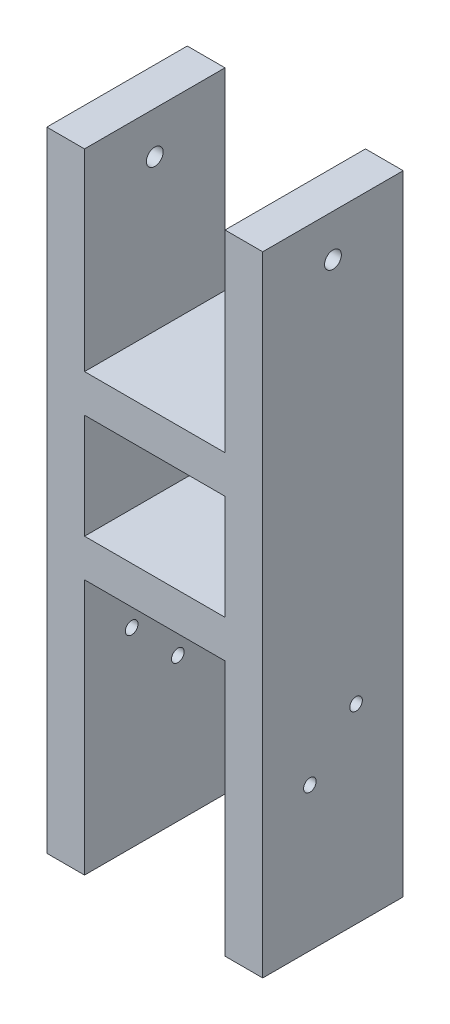
ISO-10303-21;
HEADER;
FILE_DESCRIPTION(('STEP AP214'),'2;1');
FILE_NAME('part.step','',(''),(''),'','','');
FILE_SCHEMA(('AUTOMOTIVE_DESIGN { 1 0 10303 214 1 1 1 1 }'));
ENDSEC;
DATA;
#1=APPLICATION_CONTEXT('core data for automotive mechanical design processes');
#2=APPLICATION_PROTOCOL_DEFINITION('international standard','automotive_design',2000,#1);
#3=PRODUCT_CONTEXT('',#1,'mechanical');
#4=PRODUCT('Part','Part','',(#3));
#5=PRODUCT_RELATED_PRODUCT_CATEGORY('part','',(#4));
#6=PRODUCT_DEFINITION_FORMATION('','',#4);
#7=PRODUCT_DEFINITION_CONTEXT('part definition',#1,'design');
#8=PRODUCT_DEFINITION('design','',#6,#7);
#9=PRODUCT_DEFINITION_SHAPE('','',#8);
#10=(LENGTH_UNIT() NAMED_UNIT(*) SI_UNIT(.MILLI.,.METRE.));
#11=(NAMED_UNIT(*) PLANE_ANGLE_UNIT() SI_UNIT($,.RADIAN.));
#12=(NAMED_UNIT(*) SI_UNIT($,.STERADIAN.) SOLID_ANGLE_UNIT());
#13=UNCERTAINTY_MEASURE_WITH_UNIT(LENGTH_MEASURE(1.E-05),#10,'distance_accuracy_value','');
#14=(GEOMETRIC_REPRESENTATION_CONTEXT(3) GLOBAL_UNCERTAINTY_ASSIGNED_CONTEXT((#13)) GLOBAL_UNIT_ASSIGNED_CONTEXT((#10,
#11,#12)) REPRESENTATION_CONTEXT('',''));
#15=CARTESIAN_POINT('',(0.,0.,0.));
#16=DIRECTION('',(0.,0.,1.));
#17=DIRECTION('',(1.,0.,0.));
#18=AXIS2_PLACEMENT_3D('',#15,#16,#17);
#19=CARTESIAN_POINT('',(0.,0.,67.));
#20=DIRECTION('',(0.,0.,1.));
#21=DIRECTION('',(1.,0.,0.));
#22=AXIS2_PLACEMENT_3D('',#19,#20,#21);
#23=PLANE('',#22);
#24=DIRECTION('',(1.,0.,0.));
#25=VECTOR('',#24,1.);
#26=CARTESIAN_POINT('',(68.3306347343382,23.6604982787696,67.));
#27=LINE('',#26,#25);
#28=CARTESIAN_POINT('',(1.33063473433824,23.6604982787696,67.));
#29=VERTEX_POINT('',#28);
#30=CARTESIAN_POINT('',(68.3306347343382,23.6604982787696,67.));
#31=VERTEX_POINT('',#30);
#32=EDGE_CURVE('E183',#29,#31,#27,.T.);
#33=ORIENTED_EDGE('',*,*,#32,.T.);
#34=DIRECTION('',(0.,-1.,0.));
#35=VECTOR('',#34,1.);
#36=CARTESIAN_POINT('',(68.3306347343382,23.6604982787696,67.));
#37=LINE('',#36,#35);
#38=CARTESIAN_POINT('',(68.3306347343382,-98.3395017212304,67.));
#39=VERTEX_POINT('',#38);
#40=EDGE_CURVE('E186',#31,#39,#37,.T.);
#41=ORIENTED_EDGE('',*,*,#40,.T.);
#42=DIRECTION('',(1.,0.,0.));
#43=VECTOR('',#42,1.);
#44=CARTESIAN_POINT('',(68.3306347343382,-98.3395017212304,67.));
#45=LINE('',#44,#43);
#46=CARTESIAN_POINT('',(86.3306347343382,-98.3395017212304,67.));
#47=VERTEX_POINT('',#46);
#48=EDGE_CURVE('E189',#39,#47,#45,.T.);
#49=ORIENTED_EDGE('',*,*,#48,.T.);
#50=DIRECTION('',(0.,1.,0.));
#51=VECTOR('',#50,1.);
#52=CARTESIAN_POINT('',(86.3306347343382,-98.3395017212304,67.));
#53=LINE('',#52,#51);
#54=CARTESIAN_POINT('',(86.3306347343382,201.66049827877,67.));
#55=VERTEX_POINT('',#54);
#56=EDGE_CURVE('E191',#47,#55,#53,.T.);
#57=ORIENTED_EDGE('',*,*,#56,.T.);
#58=DIRECTION('',(-1.,0.,0.));
#59=VECTOR('',#58,1.);
#60=CARTESIAN_POINT('',(86.3306347343382,201.66049827877,67.));
#61=LINE('',#60,#59);
#62=CARTESIAN_POINT('',(68.3306347343383,201.66049827877,67.));
#63=VERTEX_POINT('',#62);
#64=EDGE_CURVE('E193',#55,#63,#61,.T.);
#65=ORIENTED_EDGE('',*,*,#64,.T.);
#66=DIRECTION('',(0.,-1.,0.));
#67=VECTOR('',#66,1.);
#68=CARTESIAN_POINT('',(68.3306347343382,109.66049827877,67.));
#69=LINE('',#68,#67);
#70=CARTESIAN_POINT('',(68.3306347343382,109.66049827877,67.));
#71=VERTEX_POINT('',#70);
#72=EDGE_CURVE('E195',#63,#71,#69,.T.);
#73=ORIENTED_EDGE('',*,*,#72,.T.);
#74=DIRECTION('',(-1.,0.,0.));
#75=VECTOR('',#74,1.);
#76=CARTESIAN_POINT('',(68.3306347343382,109.66049827877,67.));
#77=LINE('',#76,#75);
#78=CARTESIAN_POINT('',(1.33063473433823,109.66049827877,67.));
#79=VERTEX_POINT('',#78);
#80=EDGE_CURVE('E197',#71,#79,#77,.T.);
#81=ORIENTED_EDGE('',*,*,#80,.T.);
#82=DIRECTION('',(0.,1.,0.));
#83=VECTOR('',#82,1.);
#84=CARTESIAN_POINT('',(1.33063473433823,109.66049827877,67.));
#85=LINE('',#84,#83);
#86=CARTESIAN_POINT('',(1.33063473433821,201.66049827877,67.));
#87=VERTEX_POINT('',#86);
#88=EDGE_CURVE('E199',#79,#87,#85,.T.);
#89=ORIENTED_EDGE('',*,*,#88,.T.);
#90=DIRECTION('',(-1.,0.,0.));
#91=VECTOR('',#90,1.);
#92=CARTESIAN_POINT('',(-16.6693652656617,201.66049827877,67.));
#93=LINE('',#92,#91);
#94=CARTESIAN_POINT('',(-16.6693652656617,201.66049827877,67.));
#95=VERTEX_POINT('',#94);
#96=EDGE_CURVE('E201',#87,#95,#93,.T.);
#97=ORIENTED_EDGE('',*,*,#96,.T.);
#98=DIRECTION('',(0.,-1.,0.));
#99=VECTOR('',#98,1.);
#100=CARTESIAN_POINT('',(-16.6693652656617,-98.3395017212304,67.));
#101=LINE('',#100,#99);
#102=CARTESIAN_POINT('',(-16.6693652656617,-98.3395017212304,67.));
#103=VERTEX_POINT('',#102);
#104=EDGE_CURVE('E203',#95,#103,#101,.T.);
#105=ORIENTED_EDGE('',*,*,#104,.T.);
#106=DIRECTION('',(1.,0.,0.));
#107=VECTOR('',#106,1.);
#108=CARTESIAN_POINT('',(1.33063473433825,-98.3395017212304,67.));
#109=LINE('',#108,#107);
#110=CARTESIAN_POINT('',(1.33063473433825,-98.3395017212304,67.));
#111=VERTEX_POINT('',#110);
#112=EDGE_CURVE('E205',#103,#111,#109,.T.);
#113=ORIENTED_EDGE('',*,*,#112,.T.);
#114=DIRECTION('',(0.,1.,0.));
#115=VECTOR('',#114,1.);
#116=CARTESIAN_POINT('',(1.33063473433824,23.6604982787696,67.));
#117=LINE('',#116,#115);
#118=EDGE_CURVE('E207',#111,#29,#117,.T.);
#119=ORIENTED_EDGE('',*,*,#118,.T.);
#120=EDGE_LOOP('',(#33,#41,#49,#57,#65,#73,#81,#89,#97,#105,#113,#119));
#121=FACE_BOUND('',#120,.T.);
#122=DIRECTION('',(1.,0.,0.));
#123=VECTOR('',#122,1.);
#124=CARTESIAN_POINT('',(1.33063473433823,41.6604982787696,67.));
#125=LINE('',#124,#123);
#126=CARTESIAN_POINT('',(1.33063473433823,41.6604982787696,67.));
#127=VERTEX_POINT('',#126);
#128=CARTESIAN_POINT('',(68.3306347343382,41.6604982787696,67.));
#129=VERTEX_POINT('',#128);
#130=EDGE_CURVE('E153',#127,#129,#125,.T.);
#131=ORIENTED_EDGE('',*,*,#130,.F.);
#132=DIRECTION('',(0.,-1.,0.));
#133=VECTOR('',#132,1.);
#134=CARTESIAN_POINT('',(1.33063473433823,41.6604982787696,67.));
#135=LINE('',#134,#133);
#136=CARTESIAN_POINT('',(1.33063473433823,91.6604982787696,67.));
#137=VERTEX_POINT('',#136);
#138=EDGE_CURVE('E145',#137,#127,#135,.T.);
#139=ORIENTED_EDGE('',*,*,#138,.F.);
#140=DIRECTION('',(-1.,0.,0.));
#141=VECTOR('',#140,1.);
#142=CARTESIAN_POINT('',(1.33063473433823,91.6604982787696,67.));
#143=LINE('',#142,#141);
#144=CARTESIAN_POINT('',(68.3306347343382,91.6604982787697,67.));
#145=VERTEX_POINT('',#144);
#146=EDGE_CURVE('E167',#145,#137,#143,.T.);
#147=ORIENTED_EDGE('',*,*,#146,.F.);
#148=DIRECTION('',(0.,1.,0.));
#149=VECTOR('',#148,1.);
#150=CARTESIAN_POINT('',(68.3306347343382,41.6604982787696,67.));
#151=LINE('',#150,#149);
#152=EDGE_CURVE('E165',#129,#145,#151,.T.);
#153=ORIENTED_EDGE('',*,*,#152,.F.);
#154=EDGE_LOOP('',(#131,#139,#147,#153));
#155=FACE_BOUND('',#154,.T.);
#156=ADVANCED_FACE('F32',(#121,#155),#23,.T.);
#157=CARTESIAN_POINT('',(0.,0.,0.));
#158=DIRECTION('',(0.,0.,1.));
#159=DIRECTION('',(1.,0.,0.));
#160=AXIS2_PLACEMENT_3D('',#157,#158,#159);
#161=PLANE('',#160);
#162=DIRECTION('',(1.,0.,0.));
#163=VECTOR('',#162,1.);
#164=CARTESIAN_POINT('',(68.3306347343382,23.6604982787696,0.));
#165=LINE('',#164,#163);
#166=CARTESIAN_POINT('',(1.33063473433824,23.6604982787696,0.));
#167=VERTEX_POINT('',#166);
#168=CARTESIAN_POINT('',(68.3306347343382,23.6604982787696,0.));
#169=VERTEX_POINT('',#168);
#170=EDGE_CURVE('E161',#167,#169,#165,.T.);
#171=ORIENTED_EDGE('',*,*,#170,.F.);
#172=DIRECTION('',(0.,1.,0.));
#173=VECTOR('',#172,1.);
#174=CARTESIAN_POINT('',(1.33063473433824,23.6604982787696,0.));
#175=LINE('',#174,#173);
#176=CARTESIAN_POINT('',(1.33063473433825,-98.3395017212304,0.));
#177=VERTEX_POINT('',#176);
#178=EDGE_CURVE('E187',#177,#167,#175,.T.);
#179=ORIENTED_EDGE('',*,*,#178,.F.);
#180=DIRECTION('',(1.,0.,0.));
#181=VECTOR('',#180,1.);
#182=CARTESIAN_POINT('',(1.33063473433825,-98.3395017212304,0.));
#183=LINE('',#182,#181);
#184=CARTESIAN_POINT('',(-16.6693652656617,-98.3395017212304,0.));
#185=VERTEX_POINT('',#184);
#186=EDGE_CURVE('E230',#185,#177,#183,.T.);
#187=ORIENTED_EDGE('',*,*,#186,.F.);
#188=DIRECTION('',(0.,-1.,0.));
#189=VECTOR('',#188,1.);
#190=CARTESIAN_POINT('',(-16.6693652656617,-98.3395017212304,0.));
#191=LINE('',#190,#189);
#192=CARTESIAN_POINT('',(-16.6693652656617,201.66049827877,0.));
#193=VERTEX_POINT('',#192);
#194=EDGE_CURVE('E228',#193,#185,#191,.T.);
#195=ORIENTED_EDGE('',*,*,#194,.F.);
#196=DIRECTION('',(-1.,0.,0.));
#197=VECTOR('',#196,1.);
#198=CARTESIAN_POINT('',(-16.6693652656617,201.66049827877,0.));
#199=LINE('',#198,#197);
#200=CARTESIAN_POINT('',(1.33063473433821,201.66049827877,0.));
#201=VERTEX_POINT('',#200);
#202=EDGE_CURVE('E226',#201,#193,#199,.T.);
#203=ORIENTED_EDGE('',*,*,#202,.F.);
#204=DIRECTION('',(0.,1.,0.));
#205=VECTOR('',#204,1.);
#206=CARTESIAN_POINT('',(1.33063473433823,109.66049827877,0.));
#207=LINE('',#206,#205);
#208=CARTESIAN_POINT('',(1.33063473433823,109.66049827877,0.));
#209=VERTEX_POINT('',#208);
#210=EDGE_CURVE('E224',#209,#201,#207,.T.);
#211=ORIENTED_EDGE('',*,*,#210,.F.);
#212=DIRECTION('',(-1.,0.,0.));
#213=VECTOR('',#212,1.);
#214=CARTESIAN_POINT('',(68.3306347343382,109.66049827877,0.));
#215=LINE('',#214,#213);
#216=CARTESIAN_POINT('',(68.3306347343382,109.66049827877,0.));
#217=VERTEX_POINT('',#216);
#218=EDGE_CURVE('E222',#217,#209,#215,.T.);
#219=ORIENTED_EDGE('',*,*,#218,.F.);
#220=DIRECTION('',(0.,-1.,0.));
#221=VECTOR('',#220,1.);
#222=CARTESIAN_POINT('',(68.3306347343382,109.66049827877,0.));
#223=LINE('',#222,#221);
#224=CARTESIAN_POINT('',(68.3306347343383,201.66049827877,0.));
#225=VERTEX_POINT('',#224);
#226=EDGE_CURVE('E220',#225,#217,#223,.T.);
#227=ORIENTED_EDGE('',*,*,#226,.F.);
#228=DIRECTION('',(-1.,0.,0.));
#229=VECTOR('',#228,1.);
#230=CARTESIAN_POINT('',(86.3306347343382,201.66049827877,0.));
#231=LINE('',#230,#229);
#232=CARTESIAN_POINT('',(86.3306347343382,201.66049827877,0.));
#233=VERTEX_POINT('',#232);
#234=EDGE_CURVE('E218',#233,#225,#231,.T.);
#235=ORIENTED_EDGE('',*,*,#234,.F.);
#236=DIRECTION('',(0.,1.,0.));
#237=VECTOR('',#236,1.);
#238=CARTESIAN_POINT('',(86.3306347343382,-98.3395017212304,0.));
#239=LINE('',#238,#237);
#240=CARTESIAN_POINT('',(86.3306347343382,-98.3395017212304,0.));
#241=VERTEX_POINT('',#240);
#242=EDGE_CURVE('E216',#241,#233,#239,.T.);
#243=ORIENTED_EDGE('',*,*,#242,.F.);
#244=DIRECTION('',(1.,0.,0.));
#245=VECTOR('',#244,1.);
#246=CARTESIAN_POINT('',(68.3306347343382,-98.3395017212304,0.));
#247=LINE('',#246,#245);
#248=CARTESIAN_POINT('',(68.3306347343382,-98.3395017212304,0.));
#249=VERTEX_POINT('',#248);
#250=EDGE_CURVE('E214',#249,#241,#247,.T.);
#251=ORIENTED_EDGE('',*,*,#250,.F.);
#252=DIRECTION('',(0.,-1.,0.));
#253=VECTOR('',#252,1.);
#254=CARTESIAN_POINT('',(68.3306347343382,23.6604982787696,0.));
#255=LINE('',#254,#253);
#256=EDGE_CURVE('E212',#169,#249,#255,.T.);
#257=ORIENTED_EDGE('',*,*,#256,.F.);
#258=EDGE_LOOP('',(#171,#179,#187,#195,#203,#211,#219,#227,#235,#243,#251,#257));
#259=FACE_BOUND('',#258,.T.);
#260=DIRECTION('',(0.,-1.,0.));
#261=VECTOR('',#260,1.);
#262=CARTESIAN_POINT('',(1.33063473433823,41.6604982787696,0.));
#263=LINE('',#262,#261);
#264=CARTESIAN_POINT('',(1.33063473433823,91.6604982787696,0.));
#265=VERTEX_POINT('',#264);
#266=CARTESIAN_POINT('',(1.33063473433823,41.6604982787696,0.));
#267=VERTEX_POINT('',#266);
#268=EDGE_CURVE('E55',#265,#267,#263,.T.);
#269=ORIENTED_EDGE('',*,*,#268,.T.);
#270=DIRECTION('',(1.,0.,0.));
#271=VECTOR('',#270,1.);
#272=CARTESIAN_POINT('',(1.33063473433823,41.6604982787696,0.));
#273=LINE('',#272,#271);
#274=CARTESIAN_POINT('',(68.3306347343382,41.6604982787696,0.));
#275=VERTEX_POINT('',#274);
#276=EDGE_CURVE('E160',#267,#275,#273,.T.);
#277=ORIENTED_EDGE('',*,*,#276,.T.);
#278=DIRECTION('',(0.,1.,0.));
#279=VECTOR('',#278,1.);
#280=CARTESIAN_POINT('',(68.3306347343382,41.6604982787696,0.));
#281=LINE('',#280,#279);
#282=CARTESIAN_POINT('',(68.3306347343382,91.6604982787697,0.));
#283=VERTEX_POINT('',#282);
#284=EDGE_CURVE('E175',#275,#283,#281,.T.);
#285=ORIENTED_EDGE('',*,*,#284,.T.);
#286=DIRECTION('',(-1.,0.,0.));
#287=VECTOR('',#286,1.);
#288=CARTESIAN_POINT('',(1.33063473433823,91.6604982787696,0.));
#289=LINE('',#288,#287);
#290=EDGE_CURVE('E154',#283,#265,#289,.T.);
#291=ORIENTED_EDGE('',*,*,#290,.T.);
#292=EDGE_LOOP('',(#269,#277,#285,#291));
#293=FACE_BOUND('',#292,.T.);
#294=ADVANCED_FACE('F272',(#259,#293),#161,.F.);
#295=CARTESIAN_POINT('',(68.3306347343382,23.6604982787696,67.));
#296=DIRECTION('',(0.,1.,0.));
#297=DIRECTION('',(-1.,0.,0.));
#298=AXIS2_PLACEMENT_3D('',#295,#296,#297);
#299=PLANE('',#298);
#300=ORIENTED_EDGE('',*,*,#170,.T.);
#301=DIRECTION('',(0.,0.,-1.));
#302=VECTOR('',#301,1.);
#303=CARTESIAN_POINT('',(68.3306347343382,23.6604982787696,67.));
#304=LINE('',#303,#302);
#305=EDGE_CURVE('E11',#31,#169,#304,.T.);
#306=ORIENTED_EDGE('',*,*,#305,.F.);
#307=ORIENTED_EDGE('',*,*,#32,.F.);
#308=DIRECTION('',(0.,0.,-1.));
#309=VECTOR('',#308,1.);
#310=CARTESIAN_POINT('',(1.33063473433824,23.6604982787696,67.));
#311=LINE('',#310,#309);
#312=EDGE_CURVE('E209',#29,#167,#311,.T.);
#313=ORIENTED_EDGE('',*,*,#312,.T.);
#314=EDGE_LOOP('',(#300,#306,#307,#313));
#315=FACE_BOUND('',#314,.T.);
#316=ADVANCED_FACE('F34',(#315),#299,.F.);
#317=CARTESIAN_POINT('',(68.3306347343382,23.6604982787696,67.));
#318=DIRECTION('',(1.,0.,0.));
#319=DIRECTION('',(0.,0.,-1.));
#320=AXIS2_PLACEMENT_3D('',#317,#318,#319);
#321=PLANE('',#320);
#322=CARTESIAN_POINT('',(68.3306347343382,-29.8395017212304,44.5));
#323=DIRECTION('',(1.,0.,0.));
#324=DIRECTION('',(0.,0.,-1.));
#325=AXIS2_PLACEMENT_3D('',#322,#323,#324);
#326=CIRCLE('',#325,3.);
#327=CARTESIAN_POINT('',(68.3306347343382,-29.8395017212304,41.5));
#328=VERTEX_POINT('',#327);
#329=EDGE_CURVE('E173',#328,#328,#326,.T.);
#330=ORIENTED_EDGE('',*,*,#329,.T.);
#331=EDGE_LOOP('',(#330));
#332=FACE_BOUND('',#331,.T.);
#333=CARTESIAN_POINT('',(68.3306347343382,-7.33950172123038,22.5));
#334=DIRECTION('',(1.,0.,0.));
#335=DIRECTION('',(0.,0.,-1.));
#336=AXIS2_PLACEMENT_3D('',#333,#334,#335);
#337=CIRCLE('',#336,3.);
#338=CARTESIAN_POINT('',(68.3306347343382,-7.33950172123038,19.4999999999999));
#339=VERTEX_POINT('',#338);
#340=EDGE_CURVE('E375',#339,#339,#337,.T.);
#341=ORIENTED_EDGE('',*,*,#340,.T.);
#342=EDGE_LOOP('',(#341));
#343=FACE_BOUND('',#342,.T.);
#344=ORIENTED_EDGE('',*,*,#256,.T.);
#345=DIRECTION('',(0.,0.,-1.));
#346=VECTOR('',#345,1.);
#347=CARTESIAN_POINT('',(68.3306347343382,-98.3395017212304,67.));
#348=LINE('',#347,#346);
#349=EDGE_CURVE('E40',#39,#249,#348,.T.);
#350=ORIENTED_EDGE('',*,*,#349,.F.);
#351=ORIENTED_EDGE('',*,*,#40,.F.);
#352=ORIENTED_EDGE('',*,*,#305,.T.);
#353=EDGE_LOOP('',(#344,#350,#351,#352));
#354=FACE_BOUND('',#353,.T.);
#355=ADVANCED_FACE('F289',(#332,#343,#354),#321,.F.);
#356=CARTESIAN_POINT('',(68.3306347343382,-98.3395017212304,67.));
#357=DIRECTION('',(0.,1.,0.));
#358=DIRECTION('',(0.,0.,1.));
#359=AXIS2_PLACEMENT_3D('',#356,#357,#358);
#360=PLANE('',#359);
#361=ORIENTED_EDGE('',*,*,#250,.T.);
#362=DIRECTION('',(0.,0.,-1.));
#363=VECTOR('',#362,1.);
#364=CARTESIAN_POINT('',(86.3306347343382,-98.3395017212304,67.));
#365=LINE('',#364,#363);
#366=EDGE_CURVE('E259',#47,#241,#365,.T.);
#367=ORIENTED_EDGE('',*,*,#366,.F.);
#368=ORIENTED_EDGE('',*,*,#48,.F.);
#369=ORIENTED_EDGE('',*,*,#349,.T.);
#370=EDGE_LOOP('',(#361,#367,#368,#369));
#371=FACE_BOUND('',#370,.T.);
#372=ADVANCED_FACE('F266',(#371),#360,.F.);
#373=CARTESIAN_POINT('',(86.3306347343382,-98.3395017212304,67.));
#374=DIRECTION('',(-1.,0.,0.));
#375=DIRECTION('',(0.,0.,1.));
#376=AXIS2_PLACEMENT_3D('',#373,#374,#375);
#377=PLANE('',#376);
#378=CARTESIAN_POINT('',(86.3306347343382,-29.8395017212304,44.5));
#379=DIRECTION('',(1.,0.,0.));
#380=DIRECTION('',(0.,0.,-1.));
#381=AXIS2_PLACEMENT_3D('',#378,#379,#380);
#382=CIRCLE('',#381,3.);
#383=CARTESIAN_POINT('',(86.3306347343382,-29.8395017212304,41.5));
#384=VERTEX_POINT('',#383);
#385=EDGE_CURVE('E372',#384,#384,#382,.T.);
#386=ORIENTED_EDGE('',*,*,#385,.F.);
#387=EDGE_LOOP('',(#386));
#388=FACE_BOUND('',#387,.T.);
#389=CARTESIAN_POINT('',(86.3306347343382,-7.33950172123038,22.5));
#390=DIRECTION('',(1.,0.,0.));
#391=DIRECTION('',(0.,0.,-1.));
#392=AXIS2_PLACEMENT_3D('',#389,#390,#391);
#393=CIRCLE('',#392,3.);
#394=CARTESIAN_POINT('',(86.3306347343382,-7.33950172123038,19.4999999999999));
#395=VERTEX_POINT('',#394);
#396=EDGE_CURVE('E378',#395,#395,#393,.T.);
#397=ORIENTED_EDGE('',*,*,#396,.F.);
#398=EDGE_LOOP('',(#397));
#399=FACE_BOUND('',#398,.T.);
#400=CARTESIAN_POINT('',(86.3306347343382,181.66049827877,33.5));
#401=DIRECTION('',(1.,0.,0.));
#402=DIRECTION('',(0.,0.,-1.));
#403=AXIS2_PLACEMENT_3D('',#400,#401,#402);
#404=CIRCLE('',#403,4.);
#405=CARTESIAN_POINT('',(86.3306347343382,181.66049827877,29.5));
#406=VERTEX_POINT('',#405);
#407=EDGE_CURVE('E382',#406,#406,#404,.T.);
#408=ORIENTED_EDGE('',*,*,#407,.F.);
#409=EDGE_LOOP('',(#408));
#410=FACE_BOUND('',#409,.T.);
#411=ORIENTED_EDGE('',*,*,#242,.T.);
#412=DIRECTION('',(0.,0.,-1.));
#413=VECTOR('',#412,1.);
#414=CARTESIAN_POINT('',(86.3306347343382,201.66049827877,67.));
#415=LINE('',#414,#413);
#416=EDGE_CURVE('E256',#55,#233,#415,.T.);
#417=ORIENTED_EDGE('',*,*,#416,.F.);
#418=ORIENTED_EDGE('',*,*,#56,.F.);
#419=ORIENTED_EDGE('',*,*,#366,.T.);
#420=EDGE_LOOP('',(#411,#417,#418,#419));
#421=FACE_BOUND('',#420,.T.);
#422=ADVANCED_FACE('F278',(#388,#399,#410,#421),#377,.F.);
#423=CARTESIAN_POINT('',(86.3306347343382,201.66049827877,67.));
#424=DIRECTION('',(0.,-1.,0.));
#425=DIRECTION('',(0.,0.,-1.));
#426=AXIS2_PLACEMENT_3D('',#423,#424,#425);
#427=PLANE('',#426);
#428=ORIENTED_EDGE('',*,*,#234,.T.);
#429=DIRECTION('',(0.,0.,-1.));
#430=VECTOR('',#429,1.);
#431=CARTESIAN_POINT('',(68.3306347343383,201.66049827877,67.));
#432=LINE('',#431,#430);
#433=EDGE_CURVE('E253',#63,#225,#432,.T.);
#434=ORIENTED_EDGE('',*,*,#433,.F.);
#435=ORIENTED_EDGE('',*,*,#64,.F.);
#436=ORIENTED_EDGE('',*,*,#416,.T.);
#437=EDGE_LOOP('',(#428,#434,#435,#436));
#438=FACE_BOUND('',#437,.T.);
#439=ADVANCED_FACE('F282',(#438),#427,.F.);
#440=CARTESIAN_POINT('',(68.3306347343382,109.66049827877,67.));
#441=DIRECTION('',(1.,0.,0.));
#442=DIRECTION('',(0.,1.,0.));
#443=AXIS2_PLACEMENT_3D('',#440,#441,#442);
#444=PLANE('',#443);
#445=CARTESIAN_POINT('',(68.3306347343382,181.66049827877,33.5));
#446=DIRECTION('',(1.,0.,0.));
#447=DIRECTION('',(0.,0.,-1.));
#448=AXIS2_PLACEMENT_3D('',#445,#446,#447);
#449=CIRCLE('',#448,4.);
#450=CARTESIAN_POINT('',(68.3306347343382,181.66049827877,29.5));
#451=VERTEX_POINT('',#450);
#452=EDGE_CURVE('E381',#451,#451,#449,.T.);
#453=ORIENTED_EDGE('',*,*,#452,.T.);
#454=EDGE_LOOP('',(#453));
#455=FACE_BOUND('',#454,.T.);
#456=ORIENTED_EDGE('',*,*,#226,.T.);
#457=DIRECTION('',(0.,0.,-1.));
#458=VECTOR('',#457,1.);
#459=CARTESIAN_POINT('',(68.3306347343382,109.66049827877,67.));
#460=LINE('',#459,#458);
#461=EDGE_CURVE('E250',#71,#217,#460,.T.);
#462=ORIENTED_EDGE('',*,*,#461,.F.);
#463=ORIENTED_EDGE('',*,*,#72,.F.);
#464=ORIENTED_EDGE('',*,*,#433,.T.);
#465=EDGE_LOOP('',(#456,#462,#463,#464));
#466=FACE_BOUND('',#465,.T.);
#467=ADVANCED_FACE('F322',(#455,#466),#444,.F.);
#468=CARTESIAN_POINT('',(68.3306347343382,109.66049827877,67.));
#469=DIRECTION('',(0.,-1.,0.));
#470=DIRECTION('',(1.,0.,0.));
#471=AXIS2_PLACEMENT_3D('',#468,#469,#470);
#472=PLANE('',#471);
#473=ORIENTED_EDGE('',*,*,#218,.T.);
#474=DIRECTION('',(0.,0.,-1.));
#475=VECTOR('',#474,1.);
#476=CARTESIAN_POINT('',(1.33063473433823,109.66049827877,67.));
#477=LINE('',#476,#475);
#478=EDGE_CURVE('E247',#79,#209,#477,.T.);
#479=ORIENTED_EDGE('',*,*,#478,.F.);
#480=ORIENTED_EDGE('',*,*,#80,.F.);
#481=ORIENTED_EDGE('',*,*,#461,.T.);
#482=EDGE_LOOP('',(#473,#479,#480,#481));
#483=FACE_BOUND('',#482,.T.);
#484=ADVANCED_FACE('F320',(#483),#472,.F.);
#485=CARTESIAN_POINT('',(1.33063473433823,109.66049827877,67.));
#486=DIRECTION('',(-1.,0.,0.));
#487=DIRECTION('',(0.,-1.,0.));
#488=AXIS2_PLACEMENT_3D('',#485,#486,#487);
#489=PLANE('',#488);
#490=CARTESIAN_POINT('',(1.33063473433825,181.66049827877,33.5));
#491=DIRECTION('',(-1.,0.,0.));
#492=DIRECTION('',(0.,-1.,0.));
#493=AXIS2_PLACEMENT_3D('',#490,#491,#492);
#494=CIRCLE('',#493,4.00000000000001);
#495=CARTESIAN_POINT('',(1.33063473433825,177.66049827877,33.5));
#496=VERTEX_POINT('',#495);
#497=EDGE_CURVE('E358',#496,#496,#494,.T.);
#498=ORIENTED_EDGE('',*,*,#497,.T.);
#499=EDGE_LOOP('',(#498));
#500=FACE_BOUND('',#499,.T.);
#501=ORIENTED_EDGE('',*,*,#210,.T.);
#502=DIRECTION('',(0.,0.,-1.));
#503=VECTOR('',#502,1.);
#504=CARTESIAN_POINT('',(1.33063473433821,201.66049827877,67.));
#505=LINE('',#504,#503);
#506=EDGE_CURVE('E244',#87,#201,#505,.T.);
#507=ORIENTED_EDGE('',*,*,#506,.F.);
#508=ORIENTED_EDGE('',*,*,#88,.F.);
#509=ORIENTED_EDGE('',*,*,#478,.T.);
#510=EDGE_LOOP('',(#501,#507,#508,#509));
#511=FACE_BOUND('',#510,.T.);
#512=ADVANCED_FACE('F316',(#500,#511),#489,.F.);
#513=CARTESIAN_POINT('',(-16.6693652656617,201.66049827877,67.));
#514=DIRECTION('',(0.,-1.,0.));
#515=DIRECTION('',(0.,0.,-1.));
#516=AXIS2_PLACEMENT_3D('',#513,#514,#515);
#517=PLANE('',#516);
#518=ORIENTED_EDGE('',*,*,#202,.T.);
#519=DIRECTION('',(0.,0.,-1.));
#520=VECTOR('',#519,1.);
#521=CARTESIAN_POINT('',(-16.6693652656617,201.66049827877,67.));
#522=LINE('',#521,#520);
#523=EDGE_CURVE('E241',#95,#193,#522,.T.);
#524=ORIENTED_EDGE('',*,*,#523,.F.);
#525=ORIENTED_EDGE('',*,*,#96,.F.);
#526=ORIENTED_EDGE('',*,*,#506,.T.);
#527=EDGE_LOOP('',(#518,#524,#525,#526));
#528=FACE_BOUND('',#527,.T.);
#529=ADVANCED_FACE('F311',(#528),#517,.F.);
#530=CARTESIAN_POINT('',(-16.6693652656617,-98.3395017212304,67.));
#531=DIRECTION('',(1.,0.,0.));
#532=DIRECTION('',(0.,1.,0.));
#533=AXIS2_PLACEMENT_3D('',#530,#531,#532);
#534=PLANE('',#533);
#535=CARTESIAN_POINT('',(-16.6693652656617,-29.8395017212304,22.5));
#536=DIRECTION('',(-1.,0.,0.));
#537=DIRECTION('',(0.,-1.,0.));
#538=AXIS2_PLACEMENT_3D('',#535,#536,#537);
#539=CIRCLE('',#538,3.);
#540=CARTESIAN_POINT('',(-16.6693652656617,-32.8395017212304,22.5));
#541=VERTEX_POINT('',#540);
#542=EDGE_CURVE('E388',#541,#541,#539,.T.);
#543=ORIENTED_EDGE('',*,*,#542,.F.);
#544=EDGE_LOOP('',(#543));
#545=FACE_BOUND('',#544,.T.);
#546=CARTESIAN_POINT('',(-16.6693652656617,-7.33950172123038,44.5));
#547=DIRECTION('',(-1.,0.,0.));
#548=DIRECTION('',(0.,-1.,0.));
#549=AXIS2_PLACEMENT_3D('',#546,#547,#548);
#550=CIRCLE('',#549,3.);
#551=CARTESIAN_POINT('',(-16.6693652656617,-10.3395017212304,44.5));
#552=VERTEX_POINT('',#551);
#553=EDGE_CURVE('E360',#552,#552,#550,.T.);
#554=ORIENTED_EDGE('',*,*,#553,.F.);
#555=EDGE_LOOP('',(#554));
#556=FACE_BOUND('',#555,.T.);
#557=CARTESIAN_POINT('',(-16.6693652656617,181.66049827877,33.5));
#558=DIRECTION('',(-1.,0.,0.));
#559=DIRECTION('',(0.,-1.,0.));
#560=AXIS2_PLACEMENT_3D('',#557,#558,#559);
#561=CIRCLE('',#560,4.00000000000001);
#562=CARTESIAN_POINT('',(-16.6693652656617,177.66049827877,33.5));
#563=VERTEX_POINT('',#562);
#564=EDGE_CURVE('E361',#563,#563,#561,.T.);
#565=ORIENTED_EDGE('',*,*,#564,.F.);
#566=EDGE_LOOP('',(#565));
#567=FACE_BOUND('',#566,.T.);
#568=ORIENTED_EDGE('',*,*,#194,.T.);
#569=DIRECTION('',(0.,0.,-1.));
#570=VECTOR('',#569,1.);
#571=CARTESIAN_POINT('',(-16.6693652656617,-98.3395017212304,67.));
#572=LINE('',#571,#570);
#573=EDGE_CURVE('E238',#103,#185,#572,.T.);
#574=ORIENTED_EDGE('',*,*,#573,.F.);
#575=ORIENTED_EDGE('',*,*,#104,.F.);
#576=ORIENTED_EDGE('',*,*,#523,.T.);
#577=EDGE_LOOP('',(#568,#574,#575,#576));
#578=FACE_BOUND('',#577,.T.);
#579=ADVANCED_FACE('F305',(#545,#556,#567,#578),#534,.F.);
#580=CARTESIAN_POINT('',(1.33063473433825,-98.3395017212304,67.));
#581=DIRECTION('',(0.,1.,0.));
#582=DIRECTION('',(0.,0.,1.));
#583=AXIS2_PLACEMENT_3D('',#580,#581,#582);
#584=PLANE('',#583);
#585=ORIENTED_EDGE('',*,*,#186,.T.);
#586=DIRECTION('',(0.,0.,-1.));
#587=VECTOR('',#586,1.);
#588=CARTESIAN_POINT('',(1.33063473433825,-98.3395017212304,67.));
#589=LINE('',#588,#587);
#590=EDGE_CURVE('E235',#111,#177,#589,.T.);
#591=ORIENTED_EDGE('',*,*,#590,.F.);
#592=ORIENTED_EDGE('',*,*,#112,.F.);
#593=ORIENTED_EDGE('',*,*,#573,.T.);
#594=EDGE_LOOP('',(#585,#591,#592,#593));
#595=FACE_BOUND('',#594,.T.);
#596=ADVANCED_FACE('F301',(#595),#584,.F.);
#597=CARTESIAN_POINT('',(1.33063473433824,23.6604982787696,67.));
#598=DIRECTION('',(-1.,0.,0.));
#599=DIRECTION('',(0.,-1.,0.));
#600=AXIS2_PLACEMENT_3D('',#597,#598,#599);
#601=PLANE('',#600);
#602=CARTESIAN_POINT('',(1.33063473433825,-29.8395017212304,22.5));
#603=DIRECTION('',(-1.,0.,0.));
#604=DIRECTION('',(0.,-1.,0.));
#605=AXIS2_PLACEMENT_3D('',#602,#603,#604);
#606=CIRCLE('',#605,3.);
#607=CARTESIAN_POINT('',(1.33063473433825,-32.8395017212304,22.5));
#608=VERTEX_POINT('',#607);
#609=EDGE_CURVE('E384',#608,#608,#606,.T.);
#610=ORIENTED_EDGE('',*,*,#609,.T.);
#611=EDGE_LOOP('',(#610));
#612=FACE_BOUND('',#611,.T.);
#613=CARTESIAN_POINT('',(1.33063473433825,-7.33950172123038,44.5));
#614=DIRECTION('',(-1.,0.,0.));
#615=DIRECTION('',(0.,-1.,0.));
#616=AXIS2_PLACEMENT_3D('',#613,#614,#615);
#617=CIRCLE('',#616,3.);
#618=CARTESIAN_POINT('',(1.33063473433825,-10.3395017212304,44.5));
#619=VERTEX_POINT('',#618);
#620=EDGE_CURVE('E364',#619,#619,#617,.T.);
#621=ORIENTED_EDGE('',*,*,#620,.T.);
#622=EDGE_LOOP('',(#621));
#623=FACE_BOUND('',#622,.T.);
#624=ORIENTED_EDGE('',*,*,#178,.T.);
#625=ORIENTED_EDGE('',*,*,#312,.F.);
#626=ORIENTED_EDGE('',*,*,#118,.F.);
#627=ORIENTED_EDGE('',*,*,#590,.T.);
#628=EDGE_LOOP('',(#624,#625,#626,#627));
#629=FACE_BOUND('',#628,.T.);
#630=ADVANCED_FACE('F296',(#612,#623,#629),#601,.F.);
#631=CARTESIAN_POINT('',(1.33063473433823,41.6604982787696,67.));
#632=DIRECTION('',(1.,0.,0.));
#633=DIRECTION('',(0.,0.,-1.));
#634=AXIS2_PLACEMENT_3D('',#631,#632,#633);
#635=PLANE('',#634);
#636=ORIENTED_EDGE('',*,*,#268,.F.);
#637=DIRECTION('',(0.,0.,-1.));
#638=VECTOR('',#637,1.);
#639=CARTESIAN_POINT('',(1.33063473433823,91.6604982787696,67.));
#640=LINE('',#639,#638);
#641=EDGE_CURVE('E149',#137,#265,#640,.T.);
#642=ORIENTED_EDGE('',*,*,#641,.F.);
#643=ORIENTED_EDGE('',*,*,#138,.T.);
#644=DIRECTION('',(0.,0.,-1.));
#645=VECTOR('',#644,1.);
#646=CARTESIAN_POINT('',(1.33063473433823,41.6604982787696,67.));
#647=LINE('',#646,#645);
#648=EDGE_CURVE('E148',#127,#267,#647,.T.);
#649=ORIENTED_EDGE('',*,*,#648,.T.);
#650=EDGE_LOOP('',(#636,#642,#643,#649));
#651=FACE_BOUND('',#650,.T.);
#652=ADVANCED_FACE('F147',(#651),#635,.T.);
#653=CARTESIAN_POINT('',(1.33063473433823,41.6604982787696,67.));
#654=DIRECTION('',(0.,1.,0.));
#655=DIRECTION('',(0.,0.,1.));
#656=AXIS2_PLACEMENT_3D('',#653,#654,#655);
#657=PLANE('',#656);
#658=ORIENTED_EDGE('',*,*,#276,.F.);
#659=ORIENTED_EDGE('',*,*,#648,.F.);
#660=ORIENTED_EDGE('',*,*,#130,.T.);
#661=DIRECTION('',(0.,0.,-1.));
#662=VECTOR('',#661,1.);
#663=CARTESIAN_POINT('',(68.3306347343382,41.6604982787696,67.));
#664=LINE('',#663,#662);
#665=EDGE_CURVE('E162',#129,#275,#664,.T.);
#666=ORIENTED_EDGE('',*,*,#665,.T.);
#667=EDGE_LOOP('',(#658,#659,#660,#666));
#668=FACE_BOUND('',#667,.T.);
#669=ADVANCED_FACE('F157',(#668),#657,.T.);
#670=CARTESIAN_POINT('',(68.3306347343382,41.6604982787696,67.));
#671=DIRECTION('',(-1.,0.,0.));
#672=DIRECTION('',(0.,0.,1.));
#673=AXIS2_PLACEMENT_3D('',#670,#671,#672);
#674=PLANE('',#673);
#675=ORIENTED_EDGE('',*,*,#284,.F.);
#676=ORIENTED_EDGE('',*,*,#665,.F.);
#677=ORIENTED_EDGE('',*,*,#152,.T.);
#678=DIRECTION('',(0.,0.,-1.));
#679=VECTOR('',#678,1.);
#680=CARTESIAN_POINT('',(68.3306347343382,91.6604982787697,67.));
#681=LINE('',#680,#679);
#682=EDGE_CURVE('E47',#145,#283,#681,.T.);
#683=ORIENTED_EDGE('',*,*,#682,.T.);
#684=EDGE_LOOP('',(#675,#676,#677,#683));
#685=FACE_BOUND('',#684,.T.);
#686=ADVANCED_FACE('F431',(#685),#674,.T.);
#687=CARTESIAN_POINT('',(1.33063473433823,91.6604982787696,67.));
#688=DIRECTION('',(0.,-1.,0.));
#689=DIRECTION('',(1.,0.,0.));
#690=AXIS2_PLACEMENT_3D('',#687,#688,#689);
#691=PLANE('',#690);
#692=ORIENTED_EDGE('',*,*,#290,.F.);
#693=ORIENTED_EDGE('',*,*,#682,.F.);
#694=ORIENTED_EDGE('',*,*,#146,.T.);
#695=ORIENTED_EDGE('',*,*,#641,.T.);
#696=EDGE_LOOP('',(#692,#693,#694,#695));
#697=FACE_BOUND('',#696,.T.);
#698=ADVANCED_FACE('F427',(#697),#691,.T.);
#699=CARTESIAN_POINT('',(68.3306347343382,181.66049827877,33.5));
#700=DIRECTION('',(1.,0.,0.));
#701=DIRECTION('',(0.,0.,-1.));
#702=AXIS2_PLACEMENT_3D('',#699,#700,#701);
#703=CYLINDRICAL_SURFACE('',#702,4.);
#704=ORIENTED_EDGE('',*,*,#452,.F.);
#705=EDGE_LOOP('',(#704));
#706=FACE_BOUND('',#705,.T.);
#707=ORIENTED_EDGE('',*,*,#407,.T.);
#708=EDGE_LOOP('',(#707));
#709=FACE_BOUND('',#708,.T.);
#710=ADVANCED_FACE('F423',(#706,#709),#703,.F.);
#711=CARTESIAN_POINT('',(68.3306347343382,-7.33950172123038,22.5));
#712=DIRECTION('',(1.,0.,0.));
#713=DIRECTION('',(0.,0.,-1.));
#714=AXIS2_PLACEMENT_3D('',#711,#712,#713);
#715=CYLINDRICAL_SURFACE('',#714,3.);
#716=ORIENTED_EDGE('',*,*,#340,.F.);
#717=EDGE_LOOP('',(#716));
#718=FACE_BOUND('',#717,.T.);
#719=ORIENTED_EDGE('',*,*,#396,.T.);
#720=EDGE_LOOP('',(#719));
#721=FACE_BOUND('',#720,.T.);
#722=ADVANCED_FACE('F419',(#718,#721),#715,.F.);
#723=CARTESIAN_POINT('',(68.3306347343382,-29.8395017212304,44.5));
#724=DIRECTION('',(1.,0.,0.));
#725=DIRECTION('',(0.,0.,-1.));
#726=AXIS2_PLACEMENT_3D('',#723,#724,#725);
#727=CYLINDRICAL_SURFACE('',#726,3.);
#728=ORIENTED_EDGE('',*,*,#329,.F.);
#729=EDGE_LOOP('',(#728));
#730=FACE_BOUND('',#729,.T.);
#731=ORIENTED_EDGE('',*,*,#385,.T.);
#732=EDGE_LOOP('',(#731));
#733=FACE_BOUND('',#732,.T.);
#734=ADVANCED_FACE('F401',(#730,#733),#727,.F.);
#735=CARTESIAN_POINT('',(1.33063473433825,-7.33950172123038,44.5));
#736=DIRECTION('',(-1.,0.,0.));
#737=DIRECTION('',(0.,-1.,0.));
#738=AXIS2_PLACEMENT_3D('',#735,#736,#737);
#739=CYLINDRICAL_SURFACE('',#738,3.);
#740=ORIENTED_EDGE('',*,*,#620,.F.);
#741=EDGE_LOOP('',(#740));
#742=FACE_BOUND('',#741,.T.);
#743=ORIENTED_EDGE('',*,*,#553,.T.);
#744=EDGE_LOOP('',(#743));
#745=FACE_BOUND('',#744,.T.);
#746=ADVANCED_FACE('F397',(#742,#745),#739,.F.);
#747=CARTESIAN_POINT('',(1.33063473433825,-29.8395017212304,22.5));
#748=DIRECTION('',(-1.,0.,0.));
#749=DIRECTION('',(0.,-1.,0.));
#750=AXIS2_PLACEMENT_3D('',#747,#748,#749);
#751=CYLINDRICAL_SURFACE('',#750,3.);
#752=ORIENTED_EDGE('',*,*,#609,.F.);
#753=EDGE_LOOP('',(#752));
#754=FACE_BOUND('',#753,.T.);
#755=ORIENTED_EDGE('',*,*,#542,.T.);
#756=EDGE_LOOP('',(#755));
#757=FACE_BOUND('',#756,.T.);
#758=ADVANCED_FACE('F400',(#754,#757),#751,.F.);
#759=CARTESIAN_POINT('',(1.33063473433825,181.66049827877,33.5));
#760=DIRECTION('',(-1.,0.,0.));
#761=DIRECTION('',(0.,-1.,0.));
#762=AXIS2_PLACEMENT_3D('',#759,#760,#761);
#763=CYLINDRICAL_SURFACE('',#762,4.00000000000001);
#764=ORIENTED_EDGE('',*,*,#497,.F.);
#765=EDGE_LOOP('',(#764));
#766=FACE_BOUND('',#765,.T.);
#767=ORIENTED_EDGE('',*,*,#564,.T.);
#768=EDGE_LOOP('',(#767));
#769=FACE_BOUND('',#768,.T.);
#770=ADVANCED_FACE('F408',(#766,#769),#763,.F.);
#771=CLOSED_SHELL('',(#156,#294,#316,#355,#372,#422,#439,#467,#484,#512,#529,#579,#596,#630,
#652,#669,#686,#698,#710,#722,#734,#746,#758,#770));
#772=MANIFOLD_SOLID_BREP('B2',#771);
#773=ADVANCED_BREP_SHAPE_REPRESENTATION('',(#18,#772),#14);
#774=SHAPE_DEFINITION_REPRESENTATION(#9,#773);
ENDSEC;
END-ISO-10303-21;
